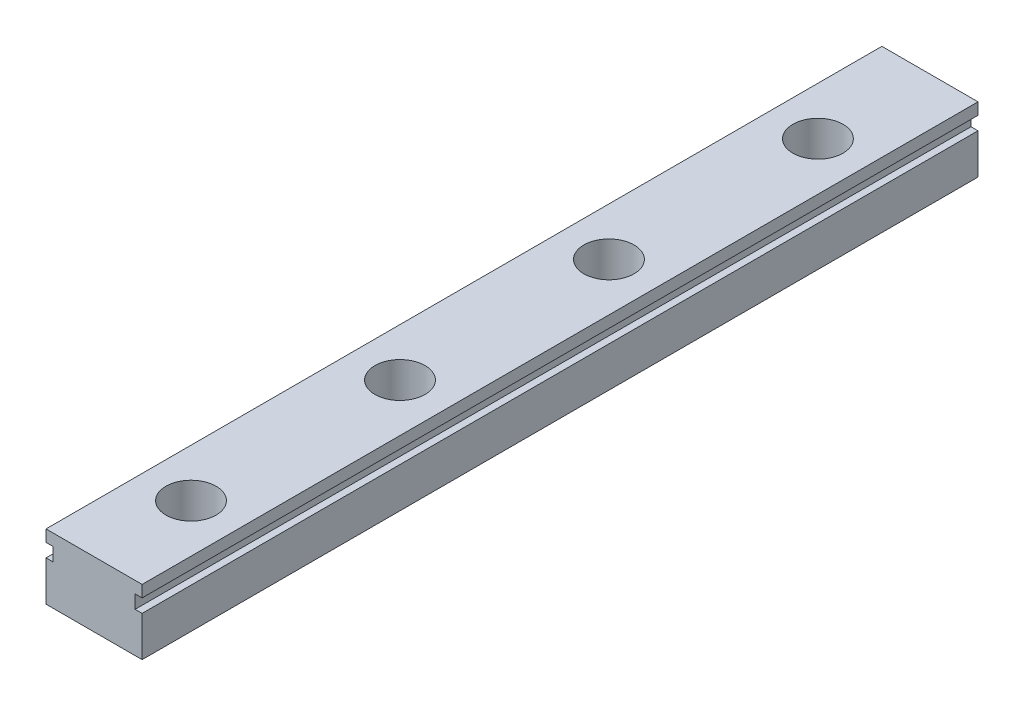
ISO-10303-21;
HEADER;
FILE_DESCRIPTION(('STEP AP214'),'2;1');
FILE_NAME('part.step','',(''),(''),'','','');
FILE_SCHEMA(('AUTOMOTIVE_DESIGN { 1 0 10303 214 1 1 1 1 }'));
ENDSEC;
DATA;
#1=APPLICATION_CONTEXT('core data for automotive mechanical design processes');
#2=APPLICATION_PROTOCOL_DEFINITION('international standard','automotive_design',2000,#1);
#3=PRODUCT_CONTEXT('',#1,'mechanical');
#4=PRODUCT('Part','Part','',(#3));
#5=PRODUCT_RELATED_PRODUCT_CATEGORY('part','',(#4));
#6=PRODUCT_DEFINITION_FORMATION('','',#4);
#7=PRODUCT_DEFINITION_CONTEXT('part definition',#1,'design');
#8=PRODUCT_DEFINITION('design','',#6,#7);
#9=PRODUCT_DEFINITION_SHAPE('','',#8);
#10=(LENGTH_UNIT() NAMED_UNIT(*) SI_UNIT(.MILLI.,.METRE.));
#11=(NAMED_UNIT(*) PLANE_ANGLE_UNIT() SI_UNIT($,.RADIAN.));
#12=(NAMED_UNIT(*) SI_UNIT($,.STERADIAN.) SOLID_ANGLE_UNIT());
#13=UNCERTAINTY_MEASURE_WITH_UNIT(LENGTH_MEASURE(1.E-05),#10,'distance_accuracy_value','');
#14=(GEOMETRIC_REPRESENTATION_CONTEXT(3) GLOBAL_UNCERTAINTY_ASSIGNED_CONTEXT((#13)) GLOBAL_UNIT_ASSIGNED_CONTEXT((#10,
#11,#12)) REPRESENTATION_CONTEXT('',''));
#15=CARTESIAN_POINT('',(0.,0.,0.));
#16=DIRECTION('',(0.,0.,1.));
#17=DIRECTION('',(1.,0.,0.));
#18=AXIS2_PLACEMENT_3D('',#15,#16,#17);
#19=CARTESIAN_POINT('',(5.75,-3.9,100.));
#20=DIRECTION('',(-1.,0.,0.));
#21=DIRECTION('',(0.,0.,1.));
#22=AXIS2_PLACEMENT_3D('',#19,#20,#21);
#23=PLANE('',#22);
#24=DIRECTION('',(0.,1.,0.));
#25=VECTOR('',#24,1.);
#26=CARTESIAN_POINT('',(5.75,-3.9,0.));
#27=LINE('',#26,#25);
#28=CARTESIAN_POINT('',(5.75,-3.9,0.));
#29=VERTEX_POINT('',#28);
#30=CARTESIAN_POINT('',(5.75,0.900000000000001,0.));
#31=VERTEX_POINT('',#30);
#32=EDGE_CURVE('E158',#29,#31,#27,.T.);
#33=ORIENTED_EDGE('',*,*,#32,.T.);
#34=DIRECTION('',(0.,0.,1.));
#35=VECTOR('',#34,1.);
#36=CARTESIAN_POINT('',(5.75,0.900000000000001,0.));
#37=LINE('',#36,#35);
#38=CARTESIAN_POINT('',(5.75,0.900000000000001,100.));
#39=VERTEX_POINT('',#38);
#40=EDGE_CURVE('E159',#31,#39,#37,.T.);
#41=ORIENTED_EDGE('',*,*,#40,.T.);
#42=DIRECTION('',(0.,1.,0.));
#43=VECTOR('',#42,1.);
#44=CARTESIAN_POINT('',(5.75,-3.9,100.));
#45=LINE('',#44,#43);
#46=CARTESIAN_POINT('',(5.75,-3.9,100.));
#47=VERTEX_POINT('',#46);
#48=EDGE_CURVE('E220',#47,#39,#45,.T.);
#49=ORIENTED_EDGE('',*,*,#48,.F.);
#50=DIRECTION('',(0.,0.,-1.));
#51=VECTOR('',#50,1.);
#52=CARTESIAN_POINT('',(5.75,-3.9,100.));
#53=LINE('',#52,#51);
#54=EDGE_CURVE('E181',#47,#29,#53,.T.);
#55=ORIENTED_EDGE('',*,*,#54,.T.);
#56=EDGE_LOOP('',(#33,#41,#49,#55));
#57=FACE_BOUND('',#56,.T.);
#58=ADVANCED_FACE('F43',(#57),#23,.F.);
#59=CARTESIAN_POINT('',(-5.75,-3.9,100.));
#60=DIRECTION('',(1.,0.,0.));
#61=DIRECTION('',(0.,0.,-1.));
#62=AXIS2_PLACEMENT_3D('',#59,#60,#61);
#63=PLANE('',#62);
#64=DIRECTION('',(0.,-1.,0.));
#65=VECTOR('',#64,1.);
#66=CARTESIAN_POINT('',(-5.75,-3.9,0.));
#67=LINE('',#66,#65);
#68=CARTESIAN_POINT('',(-5.75,3.9,0.));
#69=VERTEX_POINT('',#68);
#70=CARTESIAN_POINT('',(-5.75,2.5,0.));
#71=VERTEX_POINT('',#70);
#72=EDGE_CURVE('E174',#69,#71,#67,.T.);
#73=ORIENTED_EDGE('',*,*,#72,.T.);
#74=DIRECTION('',(0.,0.,1.));
#75=VECTOR('',#74,1.);
#76=CARTESIAN_POINT('',(-5.75,2.5,0.));
#77=LINE('',#76,#75);
#78=CARTESIAN_POINT('',(-5.75,2.5,100.));
#79=VERTEX_POINT('',#78);
#80=EDGE_CURVE('E271',#71,#79,#77,.T.);
#81=ORIENTED_EDGE('',*,*,#80,.T.);
#82=DIRECTION('',(0.,-1.,0.));
#83=VECTOR('',#82,1.);
#84=CARTESIAN_POINT('',(-5.75,-3.9,100.));
#85=LINE('',#84,#83);
#86=CARTESIAN_POINT('',(-5.75,3.9,100.));
#87=VERTEX_POINT('',#86);
#88=EDGE_CURVE('E196',#87,#79,#85,.T.);
#89=ORIENTED_EDGE('',*,*,#88,.F.);
#90=DIRECTION('',(0.,0.,-1.));
#91=VECTOR('',#90,1.);
#92=CARTESIAN_POINT('',(-5.75,3.9,100.));
#93=LINE('',#92,#91);
#94=EDGE_CURVE('E52',#87,#69,#93,.T.);
#95=ORIENTED_EDGE('',*,*,#94,.T.);
#96=EDGE_LOOP('',(#73,#81,#89,#95));
#97=FACE_BOUND('',#96,.T.);
#98=ADVANCED_FACE('F193',(#97),#63,.F.);
#99=CARTESIAN_POINT('',(5.75,2.5,100.));
#100=VERTEX_POINT('',#99);
#101=CARTESIAN_POINT('',(5.75,3.9,100.));
#102=VERTEX_POINT('',#101);
#103=EDGE_CURVE('E149',#100,#102,#45,.T.);
#104=ORIENTED_EDGE('',*,*,#103,.F.);
#105=DIRECTION('',(0.,0.,1.));
#106=VECTOR('',#105,1.);
#107=CARTESIAN_POINT('',(5.75,2.5,0.));
#108=LINE('',#107,#106);
#109=CARTESIAN_POINT('',(5.75,2.5,0.));
#110=VERTEX_POINT('',#109);
#111=EDGE_CURVE('E136',#110,#100,#108,.T.);
#112=ORIENTED_EDGE('',*,*,#111,.F.);
#113=CARTESIAN_POINT('',(5.75,3.9,0.));
#114=VERTEX_POINT('',#113);
#115=EDGE_CURVE('E147',#110,#114,#27,.T.);
#116=ORIENTED_EDGE('',*,*,#115,.T.);
#117=DIRECTION('',(0.,0.,-1.));
#118=VECTOR('',#117,1.);
#119=CARTESIAN_POINT('',(5.75,3.9,100.));
#120=LINE('',#119,#118);
#121=EDGE_CURVE('E11',#102,#114,#120,.T.);
#122=ORIENTED_EDGE('',*,*,#121,.F.);
#123=EDGE_LOOP('',(#104,#112,#116,#122));
#124=FACE_BOUND('',#123,.T.);
#125=ADVANCED_FACE('F45',(#124),#23,.F.);
#126=CARTESIAN_POINT('',(-5.75,3.9,100.));
#127=DIRECTION('',(0.,-1.,0.));
#128=DIRECTION('',(0.,0.,-1.));
#129=AXIS2_PLACEMENT_3D('',#126,#127,#128);
#130=PLANE('',#129);
#131=CARTESIAN_POINT('',(0.,3.9,88.4));
#132=DIRECTION('',(0.,1.,0.));
#133=DIRECTION('',(0.,0.,1.));
#134=AXIS2_PLACEMENT_3D('',#131,#132,#133);
#135=CIRCLE('',#134,3.);
#136=CARTESIAN_POINT('',(0.,3.9,91.4));
#137=VERTEX_POINT('',#136);
#138=EDGE_CURVE('E312',#137,#137,#135,.T.);
#139=ORIENTED_EDGE('',*,*,#138,.F.);
#140=EDGE_LOOP('',(#139));
#141=FACE_BOUND('',#140,.T.);
#142=CARTESIAN_POINT('',(0.,3.9,63.4));
#143=DIRECTION('',(0.,1.,0.));
#144=DIRECTION('',(0.,0.,1.));
#145=AXIS2_PLACEMENT_3D('',#142,#143,#144);
#146=CIRCLE('',#145,3.);
#147=CARTESIAN_POINT('',(0.,3.9,66.4));
#148=VERTEX_POINT('',#147);
#149=EDGE_CURVE('E308',#148,#148,#146,.T.);
#150=ORIENTED_EDGE('',*,*,#149,.F.);
#151=EDGE_LOOP('',(#150));
#152=FACE_BOUND('',#151,.T.);
#153=CARTESIAN_POINT('',(0.,3.9,38.4));
#154=DIRECTION('',(0.,1.,0.));
#155=DIRECTION('',(0.,0.,1.));
#156=AXIS2_PLACEMENT_3D('',#153,#154,#155);
#157=CIRCLE('',#156,3.);
#158=CARTESIAN_POINT('',(0.,3.9,41.4));
#159=VERTEX_POINT('',#158);
#160=EDGE_CURVE('E300',#159,#159,#157,.T.);
#161=ORIENTED_EDGE('',*,*,#160,.F.);
#162=EDGE_LOOP('',(#161));
#163=FACE_BOUND('',#162,.T.);
#164=CARTESIAN_POINT('',(0.,3.9,13.4000000000001));
#165=DIRECTION('',(0.,1.,0.));
#166=DIRECTION('',(0.,0.,1.));
#167=AXIS2_PLACEMENT_3D('',#164,#165,#166);
#168=CIRCLE('',#167,3.);
#169=CARTESIAN_POINT('',(0.,3.9,16.4000000000001));
#170=VERTEX_POINT('',#169);
#171=EDGE_CURVE('E291',#170,#170,#168,.T.);
#172=ORIENTED_EDGE('',*,*,#171,.F.);
#173=EDGE_LOOP('',(#172));
#174=FACE_BOUND('',#173,.T.);
#175=DIRECTION('',(-1.,0.,0.));
#176=VECTOR('',#175,1.);
#177=CARTESIAN_POINT('',(-5.75,3.9,0.));
#178=LINE('',#177,#176);
#179=EDGE_CURVE('E156',#114,#69,#178,.T.);
#180=ORIENTED_EDGE('',*,*,#179,.T.);
#181=ORIENTED_EDGE('',*,*,#94,.F.);
#182=DIRECTION('',(-1.,0.,0.));
#183=VECTOR('',#182,1.);
#184=CARTESIAN_POINT('',(-5.75,3.9,100.));
#185=LINE('',#184,#183);
#186=EDGE_CURVE('E224',#102,#87,#185,.T.);
#187=ORIENTED_EDGE('',*,*,#186,.F.);
#188=ORIENTED_EDGE('',*,*,#121,.T.);
#189=EDGE_LOOP('',(#180,#181,#187,#188));
#190=FACE_BOUND('',#189,.T.);
#191=ADVANCED_FACE('F374',(#141,#152,#163,#174,#190),#130,.F.);
#192=CARTESIAN_POINT('',(-5.75,0.900000000000001,100.));
#193=VERTEX_POINT('',#192);
#194=CARTESIAN_POINT('',(-5.75,-3.9,100.));
#195=VERTEX_POINT('',#194);
#196=EDGE_CURVE('E226',#193,#195,#85,.T.);
#197=ORIENTED_EDGE('',*,*,#196,.F.);
#198=DIRECTION('',(0.,0.,1.));
#199=VECTOR('',#198,1.);
#200=CARTESIAN_POINT('',(-5.75,0.900000000000001,0.));
#201=LINE('',#200,#199);
#202=CARTESIAN_POINT('',(-5.75,0.900000000000001,0.));
#203=VERTEX_POINT('',#202);
#204=EDGE_CURVE('E205',#203,#193,#201,.T.);
#205=ORIENTED_EDGE('',*,*,#204,.F.);
#206=CARTESIAN_POINT('',(-5.75,-3.9,0.));
#207=VERTEX_POINT('',#206);
#208=EDGE_CURVE('E173',#203,#207,#67,.T.);
#209=ORIENTED_EDGE('',*,*,#208,.T.);
#210=DIRECTION('',(0.,0.,-1.));
#211=VECTOR('',#210,1.);
#212=CARTESIAN_POINT('',(-5.75,-3.9,100.));
#213=LINE('',#212,#211);
#214=EDGE_CURVE('E185',#195,#207,#213,.T.);
#215=ORIENTED_EDGE('',*,*,#214,.F.);
#216=EDGE_LOOP('',(#197,#205,#209,#215));
#217=FACE_BOUND('',#216,.T.);
#218=ADVANCED_FACE('F242',(#217),#63,.F.);
#219=CARTESIAN_POINT('',(-5.75,-3.9,100.));
#220=DIRECTION('',(0.,1.,0.));
#221=DIRECTION('',(0.,0.,1.));
#222=AXIS2_PLACEMENT_3D('',#219,#220,#221);
#223=PLANE('',#222);
#224=CARTESIAN_POINT('',(0.,-3.9,88.4));
#225=DIRECTION('',(0.,1.,0.));
#226=DIRECTION('',(0.,0.,1.));
#227=AXIS2_PLACEMENT_3D('',#224,#225,#226);
#228=CIRCLE('',#227,1.69999999999999);
#229=CARTESIAN_POINT('',(0.,-3.9,90.1));
#230=VERTEX_POINT('',#229);
#231=EDGE_CURVE('E292',#230,#230,#228,.T.);
#232=ORIENTED_EDGE('',*,*,#231,.T.);
#233=EDGE_LOOP('',(#232));
#234=FACE_BOUND('',#233,.T.);
#235=CARTESIAN_POINT('',(0.,-3.9,63.4));
#236=DIRECTION('',(0.,1.,0.));
#237=DIRECTION('',(0.,0.,1.));
#238=AXIS2_PLACEMENT_3D('',#235,#236,#237);
#239=CIRCLE('',#238,1.69999999999999);
#240=CARTESIAN_POINT('',(0.,-3.9,65.1));
#241=VERTEX_POINT('',#240);
#242=EDGE_CURVE('E335',#241,#241,#239,.T.);
#243=ORIENTED_EDGE('',*,*,#242,.T.);
#244=EDGE_LOOP('',(#243));
#245=FACE_BOUND('',#244,.T.);
#246=CARTESIAN_POINT('',(0.,-3.9,38.4));
#247=DIRECTION('',(0.,1.,0.));
#248=DIRECTION('',(0.,0.,1.));
#249=AXIS2_PLACEMENT_3D('',#246,#247,#248);
#250=CIRCLE('',#249,1.69999999999999);
#251=CARTESIAN_POINT('',(0.,-3.9,40.1));
#252=VERTEX_POINT('',#251);
#253=EDGE_CURVE('E327',#252,#252,#250,.T.);
#254=ORIENTED_EDGE('',*,*,#253,.T.);
#255=EDGE_LOOP('',(#254));
#256=FACE_BOUND('',#255,.T.);
#257=CARTESIAN_POINT('',(0.,-3.9,13.4000000000001));
#258=DIRECTION('',(0.,1.,0.));
#259=DIRECTION('',(0.,0.,1.));
#260=AXIS2_PLACEMENT_3D('',#257,#258,#259);
#261=CIRCLE('',#260,1.7);
#262=CARTESIAN_POINT('',(0.,-3.9,15.1000000000001));
#263=VERTEX_POINT('',#262);
#264=EDGE_CURVE('E319',#263,#263,#261,.T.);
#265=ORIENTED_EDGE('',*,*,#264,.T.);
#266=EDGE_LOOP('',(#265));
#267=FACE_BOUND('',#266,.T.);
#268=DIRECTION('',(1.,0.,0.));
#269=VECTOR('',#268,1.);
#270=CARTESIAN_POINT('',(-5.75,-3.9,0.));
#271=LINE('',#270,#269);
#272=EDGE_CURVE('E178',#207,#29,#271,.T.);
#273=ORIENTED_EDGE('',*,*,#272,.T.);
#274=ORIENTED_EDGE('',*,*,#54,.F.);
#275=DIRECTION('',(1.,0.,0.));
#276=VECTOR('',#275,1.);
#277=CARTESIAN_POINT('',(-5.75,-3.9,100.));
#278=LINE('',#277,#276);
#279=EDGE_CURVE('E169',#195,#47,#278,.T.);
#280=ORIENTED_EDGE('',*,*,#279,.F.);
#281=ORIENTED_EDGE('',*,*,#214,.T.);
#282=EDGE_LOOP('',(#273,#274,#280,#281));
#283=FACE_BOUND('',#282,.T.);
#284=ADVANCED_FACE('F246',(#234,#245,#256,#267,#283),#223,.F.);
#285=CARTESIAN_POINT('',(0.,0.,100.));
#286=DIRECTION('',(0.,0.,-1.));
#287=DIRECTION('',(-1.,0.,0.));
#288=AXIS2_PLACEMENT_3D('',#285,#286,#287);
#289=PLANE('',#288);
#290=ORIENTED_EDGE('',*,*,#48,.T.);
#291=DIRECTION('',(1.,0.,0.));
#292=VECTOR('',#291,1.);
#293=CARTESIAN_POINT('',(5.75,0.900000000000001,100.));
#294=LINE('',#293,#292);
#295=CARTESIAN_POINT('',(4.91474977144023,0.900000000000001,100.));
#296=VERTEX_POINT('',#295);
#297=EDGE_CURVE('E142',#296,#39,#294,.T.);
#298=ORIENTED_EDGE('',*,*,#297,.F.);
#299=DIRECTION('',(0.,-1.,0.));
#300=VECTOR('',#299,1.);
#301=CARTESIAN_POINT('',(4.91474977144023,2.5,100.));
#302=LINE('',#301,#300);
#303=CARTESIAN_POINT('',(4.91474977144023,2.5,100.));
#304=VERTEX_POINT('',#303);
#305=EDGE_CURVE('E253',#304,#296,#302,.T.);
#306=ORIENTED_EDGE('',*,*,#305,.F.);
#307=DIRECTION('',(-1.,0.,0.));
#308=VECTOR('',#307,1.);
#309=CARTESIAN_POINT('',(5.75,2.5,100.));
#310=LINE('',#309,#308);
#311=EDGE_CURVE('E258',#100,#304,#310,.T.);
#312=ORIENTED_EDGE('',*,*,#311,.F.);
#313=ORIENTED_EDGE('',*,*,#103,.T.);
#314=ORIENTED_EDGE('',*,*,#186,.T.);
#315=ORIENTED_EDGE('',*,*,#88,.T.);
#316=DIRECTION('',(-1.,0.,0.));
#317=VECTOR('',#316,1.);
#318=CARTESIAN_POINT('',(-5.75,2.5,100.));
#319=LINE('',#318,#317);
#320=CARTESIAN_POINT('',(-4.91474977144023,2.5,100.));
#321=VERTEX_POINT('',#320);
#322=EDGE_CURVE('E219',#321,#79,#319,.T.);
#323=ORIENTED_EDGE('',*,*,#322,.F.);
#324=DIRECTION('',(0.,1.,0.));
#325=VECTOR('',#324,1.);
#326=CARTESIAN_POINT('',(-4.91474977144023,2.5,100.));
#327=LINE('',#326,#325);
#328=CARTESIAN_POINT('',(-4.91474977144023,0.900000000000001,100.));
#329=VERTEX_POINT('',#328);
#330=EDGE_CURVE('E276',#329,#321,#327,.T.);
#331=ORIENTED_EDGE('',*,*,#330,.F.);
#332=DIRECTION('',(1.,0.,0.));
#333=VECTOR('',#332,1.);
#334=CARTESIAN_POINT('',(-5.75,0.900000000000001,100.));
#335=LINE('',#334,#333);
#336=EDGE_CURVE('E214',#193,#329,#335,.T.);
#337=ORIENTED_EDGE('',*,*,#336,.F.);
#338=ORIENTED_EDGE('',*,*,#196,.T.);
#339=ORIENTED_EDGE('',*,*,#279,.T.);
#340=EDGE_LOOP('',(#290,#298,#306,#312,#313,#314,#315,#323,#331,#337,#338,#339));
#341=FACE_BOUND('',#340,.T.);
#342=ADVANCED_FACE('F235',(#341),#289,.F.);
#343=CARTESIAN_POINT('',(0.,0.,0.));
#344=DIRECTION('',(0.,0.,-1.));
#345=DIRECTION('',(-1.,0.,0.));
#346=AXIS2_PLACEMENT_3D('',#343,#344,#345);
#347=PLANE('',#346);
#348=DIRECTION('',(1.,0.,0.));
#349=VECTOR('',#348,1.);
#350=CARTESIAN_POINT('',(5.75,0.900000000000001,0.));
#351=LINE('',#350,#349);
#352=CARTESIAN_POINT('',(4.91474977144023,0.900000000000001,0.));
#353=VERTEX_POINT('',#352);
#354=EDGE_CURVE('E151',#353,#31,#351,.T.);
#355=ORIENTED_EDGE('',*,*,#354,.T.);
#356=ORIENTED_EDGE('',*,*,#32,.F.);
#357=ORIENTED_EDGE('',*,*,#272,.F.);
#358=ORIENTED_EDGE('',*,*,#208,.F.);
#359=DIRECTION('',(1.,0.,0.));
#360=VECTOR('',#359,1.);
#361=CARTESIAN_POINT('',(-5.75,0.900000000000001,0.));
#362=LINE('',#361,#360);
#363=CARTESIAN_POINT('',(-4.91474977144023,0.900000000000001,0.));
#364=VERTEX_POINT('',#363);
#365=EDGE_CURVE('E209',#203,#364,#362,.T.);
#366=ORIENTED_EDGE('',*,*,#365,.T.);
#367=DIRECTION('',(0.,1.,0.));
#368=VECTOR('',#367,1.);
#369=CARTESIAN_POINT('',(-4.91474977144023,2.5,0.));
#370=LINE('',#369,#368);
#371=CARTESIAN_POINT('',(-4.91474977144023,2.5,0.));
#372=VERTEX_POINT('',#371);
#373=EDGE_CURVE('E67',#364,#372,#370,.T.);
#374=ORIENTED_EDGE('',*,*,#373,.T.);
#375=DIRECTION('',(-1.,0.,0.));
#376=VECTOR('',#375,1.);
#377=CARTESIAN_POINT('',(-5.75,2.5,0.));
#378=LINE('',#377,#376);
#379=EDGE_CURVE('E201',#372,#71,#378,.T.);
#380=ORIENTED_EDGE('',*,*,#379,.T.);
#381=ORIENTED_EDGE('',*,*,#72,.F.);
#382=ORIENTED_EDGE('',*,*,#179,.F.);
#383=ORIENTED_EDGE('',*,*,#115,.F.);
#384=DIRECTION('',(-1.,0.,0.));
#385=VECTOR('',#384,1.);
#386=CARTESIAN_POINT('',(5.75,2.5,0.));
#387=LINE('',#386,#385);
#388=CARTESIAN_POINT('',(4.91474977144023,2.5,0.));
#389=VERTEX_POINT('',#388);
#390=EDGE_CURVE('E132',#110,#389,#387,.T.);
#391=ORIENTED_EDGE('',*,*,#390,.T.);
#392=DIRECTION('',(0.,-1.,0.));
#393=VECTOR('',#392,1.);
#394=CARTESIAN_POINT('',(4.91474977144023,2.5,0.));
#395=LINE('',#394,#393);
#396=EDGE_CURVE('E59',#389,#353,#395,.T.);
#397=ORIENTED_EDGE('',*,*,#396,.T.);
#398=EDGE_LOOP('',(#355,#356,#357,#358,#366,#374,#380,#381,#382,#383,#391,#397));
#399=FACE_BOUND('',#398,.T.);
#400=ADVANCED_FACE('F154',(#399),#347,.T.);
#401=CARTESIAN_POINT('',(-5.75,2.5,0.));
#402=DIRECTION('',(0.,1.,0.));
#403=DIRECTION('',(0.,0.,1.));
#404=AXIS2_PLACEMENT_3D('',#401,#402,#403);
#405=PLANE('',#404);
#406=ORIENTED_EDGE('',*,*,#322,.T.);
#407=ORIENTED_EDGE('',*,*,#80,.F.);
#408=ORIENTED_EDGE('',*,*,#379,.F.);
#409=DIRECTION('',(0.,0.,1.));
#410=VECTOR('',#409,1.);
#411=CARTESIAN_POINT('',(-4.91474977144023,2.5,0.));
#412=LINE('',#411,#410);
#413=EDGE_CURVE('E268',#372,#321,#412,.T.);
#414=ORIENTED_EDGE('',*,*,#413,.T.);
#415=EDGE_LOOP('',(#406,#407,#408,#414));
#416=FACE_BOUND('',#415,.T.);
#417=ADVANCED_FACE('F441',(#416),#405,.F.);
#418=CARTESIAN_POINT('',(-4.91474977144023,2.5,0.));
#419=DIRECTION('',(1.,0.,0.));
#420=DIRECTION('',(0.,0.,-1.));
#421=AXIS2_PLACEMENT_3D('',#418,#419,#420);
#422=PLANE('',#421);
#423=ORIENTED_EDGE('',*,*,#330,.T.);
#424=ORIENTED_EDGE('',*,*,#413,.F.);
#425=ORIENTED_EDGE('',*,*,#373,.F.);
#426=DIRECTION('',(0.,0.,1.));
#427=VECTOR('',#426,1.);
#428=CARTESIAN_POINT('',(-4.91474977144023,0.900000000000001,0.));
#429=LINE('',#428,#427);
#430=EDGE_CURVE('E211',#364,#329,#429,.T.);
#431=ORIENTED_EDGE('',*,*,#430,.T.);
#432=EDGE_LOOP('',(#423,#424,#425,#431));
#433=FACE_BOUND('',#432,.T.);
#434=ADVANCED_FACE('F448',(#433),#422,.F.);
#435=CARTESIAN_POINT('',(-5.75,0.900000000000001,0.));
#436=DIRECTION('',(0.,-1.,0.));
#437=DIRECTION('',(0.,0.,-1.));
#438=AXIS2_PLACEMENT_3D('',#435,#436,#437);
#439=PLANE('',#438);
#440=ORIENTED_EDGE('',*,*,#336,.T.);
#441=ORIENTED_EDGE('',*,*,#430,.F.);
#442=ORIENTED_EDGE('',*,*,#365,.F.);
#443=ORIENTED_EDGE('',*,*,#204,.T.);
#444=EDGE_LOOP('',(#440,#441,#442,#443));
#445=FACE_BOUND('',#444,.T.);
#446=ADVANCED_FACE('F455',(#445),#439,.F.);
#447=CARTESIAN_POINT('',(5.75,0.900000000000001,0.));
#448=DIRECTION('',(0.,-1.,0.));
#449=DIRECTION('',(0.,0.,-1.));
#450=AXIS2_PLACEMENT_3D('',#447,#448,#449);
#451=PLANE('',#450);
#452=ORIENTED_EDGE('',*,*,#297,.T.);
#453=ORIENTED_EDGE('',*,*,#40,.F.);
#454=ORIENTED_EDGE('',*,*,#354,.F.);
#455=DIRECTION('',(0.,0.,1.));
#456=VECTOR('',#455,1.);
#457=CARTESIAN_POINT('',(4.91474977144023,0.900000000000001,0.));
#458=LINE('',#457,#456);
#459=EDGE_CURVE('E165',#353,#296,#458,.T.);
#460=ORIENTED_EDGE('',*,*,#459,.T.);
#461=EDGE_LOOP('',(#452,#453,#454,#460));
#462=FACE_BOUND('',#461,.T.);
#463=ADVANCED_FACE('F462',(#462),#451,.F.);
#464=CARTESIAN_POINT('',(4.91474977144023,2.5,0.));
#465=DIRECTION('',(-1.,0.,0.));
#466=DIRECTION('',(0.,0.,1.));
#467=AXIS2_PLACEMENT_3D('',#464,#465,#466);
#468=PLANE('',#467);
#469=ORIENTED_EDGE('',*,*,#305,.T.);
#470=ORIENTED_EDGE('',*,*,#459,.F.);
#471=ORIENTED_EDGE('',*,*,#396,.F.);
#472=DIRECTION('',(0.,0.,1.));
#473=VECTOR('',#472,1.);
#474=CARTESIAN_POINT('',(4.91474977144023,2.5,0.));
#475=LINE('',#474,#473);
#476=EDGE_CURVE('E138',#389,#304,#475,.T.);
#477=ORIENTED_EDGE('',*,*,#476,.T.);
#478=EDGE_LOOP('',(#469,#470,#471,#477));
#479=FACE_BOUND('',#478,.T.);
#480=ADVANCED_FACE('F397',(#479),#468,.F.);
#481=CARTESIAN_POINT('',(5.75,2.5,0.));
#482=DIRECTION('',(0.,1.,0.));
#483=DIRECTION('',(0.,0.,1.));
#484=AXIS2_PLACEMENT_3D('',#481,#482,#483);
#485=PLANE('',#484);
#486=ORIENTED_EDGE('',*,*,#311,.T.);
#487=ORIENTED_EDGE('',*,*,#476,.F.);
#488=ORIENTED_EDGE('',*,*,#390,.F.);
#489=ORIENTED_EDGE('',*,*,#111,.T.);
#490=EDGE_LOOP('',(#486,#487,#488,#489));
#491=FACE_BOUND('',#490,.T.);
#492=ADVANCED_FACE('F135',(#491),#485,.F.);
#493=CARTESIAN_POINT('',(0.,-0.799999999999999,13.4000000000001));
#494=DIRECTION('',(0.,1.,0.));
#495=DIRECTION('',(0.,0.,1.));
#496=AXIS2_PLACEMENT_3D('',#493,#494,#495);
#497=CYLINDRICAL_SURFACE('',#496,3.);
#498=CARTESIAN_POINT('',(0.,-0.799999999999999,13.4000000000001));
#499=DIRECTION('',(0.,1.,0.));
#500=DIRECTION('',(0.,0.,1.));
#501=AXIS2_PLACEMENT_3D('',#498,#499,#500);
#502=CIRCLE('',#501,3.);
#503=CARTESIAN_POINT('',(0.,-0.799999999999999,16.4000000000001));
#504=VERTEX_POINT('',#503);
#505=EDGE_CURVE('E287',#504,#504,#502,.T.);
#506=ORIENTED_EDGE('',*,*,#505,.F.);
#507=EDGE_LOOP('',(#506));
#508=FACE_BOUND('',#507,.T.);
#509=ORIENTED_EDGE('',*,*,#171,.T.);
#510=EDGE_LOOP('',(#509));
#511=FACE_BOUND('',#510,.T.);
#512=ADVANCED_FACE('F385',(#508,#511),#497,.F.);
#513=CARTESIAN_POINT('',(0.,-0.799999999999999,13.4000000000001));
#514=DIRECTION('',(0.,1.,0.));
#515=DIRECTION('',(0.,0.,1.));
#516=AXIS2_PLACEMENT_3D('',#513,#514,#515);
#517=PLANE('',#516);
#518=CARTESIAN_POINT('',(0.,-0.799999999999999,13.4000000000001));
#519=DIRECTION('',(0.,1.,0.));
#520=DIRECTION('',(0.,0.,1.));
#521=AXIS2_PLACEMENT_3D('',#518,#519,#520);
#522=CIRCLE('',#521,1.7);
#523=CARTESIAN_POINT('',(0.,-0.799999999999999,15.1000000000001));
#524=VERTEX_POINT('',#523);
#525=EDGE_CURVE('E323',#524,#524,#522,.T.);
#526=ORIENTED_EDGE('',*,*,#525,.F.);
#527=EDGE_LOOP('',(#526));
#528=FACE_BOUND('',#527,.T.);
#529=ORIENTED_EDGE('',*,*,#505,.T.);
#530=EDGE_LOOP('',(#529));
#531=FACE_BOUND('',#530,.T.);
#532=ADVANCED_FACE('F387',(#528,#531),#517,.T.);
#533=CARTESIAN_POINT('',(0.,-0.799999999999999,38.4));
#534=DIRECTION('',(0.,1.,0.));
#535=DIRECTION('',(0.,0.,1.));
#536=AXIS2_PLACEMENT_3D('',#533,#534,#535);
#537=CYLINDRICAL_SURFACE('',#536,3.);
#538=CARTESIAN_POINT('',(0.,-0.799999999999999,38.4));
#539=DIRECTION('',(0.,1.,0.));
#540=DIRECTION('',(0.,0.,1.));
#541=AXIS2_PLACEMENT_3D('',#538,#539,#540);
#542=CIRCLE('',#541,3.);
#543=CARTESIAN_POINT('',(0.,-0.799999999999999,41.4));
#544=VERTEX_POINT('',#543);
#545=EDGE_CURVE('E296',#544,#544,#542,.T.);
#546=ORIENTED_EDGE('',*,*,#545,.F.);
#547=EDGE_LOOP('',(#546));
#548=FACE_BOUND('',#547,.T.);
#549=ORIENTED_EDGE('',*,*,#160,.T.);
#550=EDGE_LOOP('',(#549));
#551=FACE_BOUND('',#550,.T.);
#552=ADVANCED_FACE('F394',(#548,#551),#537,.F.);
#553=CARTESIAN_POINT('',(0.,-0.799999999999999,38.4));
#554=DIRECTION('',(0.,1.,0.));
#555=DIRECTION('',(0.,0.,1.));
#556=AXIS2_PLACEMENT_3D('',#553,#554,#555);
#557=PLANE('',#556);
#558=CARTESIAN_POINT('',(0.,-0.799999999999999,38.4));
#559=DIRECTION('',(0.,1.,0.));
#560=DIRECTION('',(0.,0.,1.));
#561=AXIS2_PLACEMENT_3D('',#558,#559,#560);
#562=CIRCLE('',#561,1.69999999999999);
#563=CARTESIAN_POINT('',(0.,-0.799999999999999,40.1));
#564=VERTEX_POINT('',#563);
#565=EDGE_CURVE('E331',#564,#564,#562,.T.);
#566=ORIENTED_EDGE('',*,*,#565,.F.);
#567=EDGE_LOOP('',(#566));
#568=FACE_BOUND('',#567,.T.);
#569=ORIENTED_EDGE('',*,*,#545,.T.);
#570=EDGE_LOOP('',(#569));
#571=FACE_BOUND('',#570,.T.);
#572=ADVANCED_FACE('F507',(#568,#571),#557,.T.);
#573=CARTESIAN_POINT('',(0.,-0.799999999999999,63.4));
#574=DIRECTION('',(0.,1.,0.));
#575=DIRECTION('',(0.,0.,1.));
#576=AXIS2_PLACEMENT_3D('',#573,#574,#575);
#577=CYLINDRICAL_SURFACE('',#576,3.);
#578=CARTESIAN_POINT('',(0.,-0.799999999999999,63.4));
#579=DIRECTION('',(0.,1.,0.));
#580=DIRECTION('',(0.,0.,1.));
#581=AXIS2_PLACEMENT_3D('',#578,#579,#580);
#582=CIRCLE('',#581,3.);
#583=CARTESIAN_POINT('',(0.,-0.799999999999999,66.4));
#584=VERTEX_POINT('',#583);
#585=EDGE_CURVE('E304',#584,#584,#582,.T.);
#586=ORIENTED_EDGE('',*,*,#585,.F.);
#587=EDGE_LOOP('',(#586));
#588=FACE_BOUND('',#587,.T.);
#589=ORIENTED_EDGE('',*,*,#149,.T.);
#590=EDGE_LOOP('',(#589));
#591=FACE_BOUND('',#590,.T.);
#592=ADVANCED_FACE('F518',(#588,#591),#577,.F.);
#593=CARTESIAN_POINT('',(0.,-0.799999999999999,63.4));
#594=DIRECTION('',(0.,1.,0.));
#595=DIRECTION('',(0.,0.,1.));
#596=AXIS2_PLACEMENT_3D('',#593,#594,#595);
#597=PLANE('',#596);
#598=CARTESIAN_POINT('',(0.,-0.799999999999999,63.4));
#599=DIRECTION('',(0.,1.,0.));
#600=DIRECTION('',(0.,0.,1.));
#601=AXIS2_PLACEMENT_3D('',#598,#599,#600);
#602=CIRCLE('',#601,1.69999999999999);
#603=CARTESIAN_POINT('',(0.,-0.799999999999999,65.1));
#604=VERTEX_POINT('',#603);
#605=EDGE_CURVE('E339',#604,#604,#602,.T.);
#606=ORIENTED_EDGE('',*,*,#605,.F.);
#607=EDGE_LOOP('',(#606));
#608=FACE_BOUND('',#607,.T.);
#609=ORIENTED_EDGE('',*,*,#585,.T.);
#610=EDGE_LOOP('',(#609));
#611=FACE_BOUND('',#610,.T.);
#612=ADVANCED_FACE('F370',(#608,#611),#597,.T.);
#613=CARTESIAN_POINT('',(0.,-0.799999999999999,88.4));
#614=DIRECTION('',(0.,1.,0.));
#615=DIRECTION('',(0.,0.,1.));
#616=AXIS2_PLACEMENT_3D('',#613,#614,#615);
#617=CYLINDRICAL_SURFACE('',#616,3.);
#618=CARTESIAN_POINT('',(0.,-0.799999999999999,88.4));
#619=DIRECTION('',(0.,1.,0.));
#620=DIRECTION('',(0.,0.,1.));
#621=AXIS2_PLACEMENT_3D('',#618,#619,#620);
#622=CIRCLE('',#621,3.);
#623=CARTESIAN_POINT('',(0.,-0.799999999999999,91.4));
#624=VERTEX_POINT('',#623);
#625=EDGE_CURVE('E274',#624,#624,#622,.T.);
#626=ORIENTED_EDGE('',*,*,#625,.F.);
#627=EDGE_LOOP('',(#626));
#628=FACE_BOUND('',#627,.T.);
#629=ORIENTED_EDGE('',*,*,#138,.T.);
#630=EDGE_LOOP('',(#629));
#631=FACE_BOUND('',#630,.T.);
#632=ADVANCED_FACE('F364',(#628,#631),#617,.F.);
#633=CARTESIAN_POINT('',(0.,-0.799999999999999,88.4));
#634=DIRECTION('',(0.,1.,0.));
#635=DIRECTION('',(0.,0.,1.));
#636=AXIS2_PLACEMENT_3D('',#633,#634,#635);
#637=PLANE('',#636);
#638=CARTESIAN_POINT('',(0.,-0.799999999999999,88.4));
#639=DIRECTION('',(0.,1.,0.));
#640=DIRECTION('',(0.,0.,1.));
#641=AXIS2_PLACEMENT_3D('',#638,#639,#640);
#642=CIRCLE('',#641,1.69999999999999);
#643=CARTESIAN_POINT('',(0.,-0.799999999999999,90.1));
#644=VERTEX_POINT('',#643);
#645=EDGE_CURVE('E343',#644,#644,#642,.T.);
#646=ORIENTED_EDGE('',*,*,#645,.F.);
#647=EDGE_LOOP('',(#646));
#648=FACE_BOUND('',#647,.T.);
#649=ORIENTED_EDGE('',*,*,#625,.T.);
#650=EDGE_LOOP('',(#649));
#651=FACE_BOUND('',#650,.T.);
#652=ADVANCED_FACE('F360',(#648,#651),#637,.T.);
#653=CARTESIAN_POINT('',(0.,-3.9,13.4000000000001));
#654=DIRECTION('',(0.,1.,0.));
#655=DIRECTION('',(0.,0.,1.));
#656=AXIS2_PLACEMENT_3D('',#653,#654,#655);
#657=CYLINDRICAL_SURFACE('',#656,1.7);
#658=ORIENTED_EDGE('',*,*,#264,.F.);
#659=EDGE_LOOP('',(#658));
#660=FACE_BOUND('',#659,.T.);
#661=ORIENTED_EDGE('',*,*,#525,.T.);
#662=EDGE_LOOP('',(#661));
#663=FACE_BOUND('',#662,.T.);
#664=ADVANCED_FACE('F363',(#660,#663),#657,.F.);
#665=CARTESIAN_POINT('',(0.,-3.9,38.4));
#666=DIRECTION('',(0.,1.,0.));
#667=DIRECTION('',(0.,0.,1.));
#668=AXIS2_PLACEMENT_3D('',#665,#666,#667);
#669=CYLINDRICAL_SURFACE('',#668,1.69999999999999);
#670=ORIENTED_EDGE('',*,*,#253,.F.);
#671=EDGE_LOOP('',(#670));
#672=FACE_BOUND('',#671,.T.);
#673=ORIENTED_EDGE('',*,*,#565,.T.);
#674=EDGE_LOOP('',(#673));
#675=FACE_BOUND('',#674,.T.);
#676=ADVANCED_FACE('F560',(#672,#675),#669,.F.);
#677=CARTESIAN_POINT('',(0.,-3.9,63.4));
#678=DIRECTION('',(0.,1.,0.));
#679=DIRECTION('',(0.,0.,1.));
#680=AXIS2_PLACEMENT_3D('',#677,#678,#679);
#681=CYLINDRICAL_SURFACE('',#680,1.69999999999999);
#682=ORIENTED_EDGE('',*,*,#242,.F.);
#683=EDGE_LOOP('',(#682));
#684=FACE_BOUND('',#683,.T.);
#685=ORIENTED_EDGE('',*,*,#605,.T.);
#686=EDGE_LOOP('',(#685));
#687=FACE_BOUND('',#686,.T.);
#688=ADVANCED_FACE('F356',(#684,#687),#681,.F.);
#689=CARTESIAN_POINT('',(0.,-3.9,88.4));
#690=DIRECTION('',(0.,1.,0.));
#691=DIRECTION('',(0.,0.,1.));
#692=AXIS2_PLACEMENT_3D('',#689,#690,#691);
#693=CYLINDRICAL_SURFACE('',#692,1.69999999999999);
#694=ORIENTED_EDGE('',*,*,#231,.F.);
#695=EDGE_LOOP('',(#694));
#696=FACE_BOUND('',#695,.T.);
#697=ORIENTED_EDGE('',*,*,#645,.T.);
#698=EDGE_LOOP('',(#697));
#699=FACE_BOUND('',#698,.T.);
#700=ADVANCED_FACE('F353',(#696,#699),#693,.F.);
#701=CLOSED_SHELL('',(#58,#98,#125,#191,#218,#284,#342,#400,#417,#434,#446,#463,#480,#492,#512,
#532,#552,#572,#592,#612,#632,#652,#664,#676,#688,#700));
#702=MANIFOLD_SOLID_BREP('B2',#701);
#703=ADVANCED_BREP_SHAPE_REPRESENTATION('',(#18,#702),#14);
#704=SHAPE_DEFINITION_REPRESENTATION(#9,#703);
ENDSEC;
END-ISO-10303-21;
